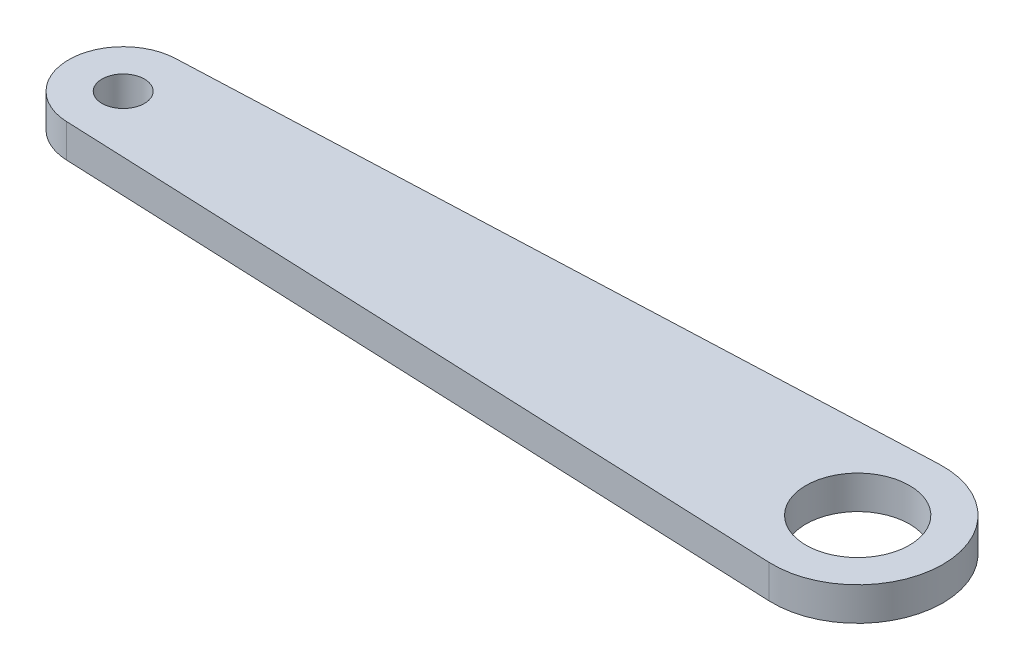
ISO-10303-21;
HEADER;
FILE_DESCRIPTION(('STEP AP214'),'2;1');
FILE_NAME('part.step','',(''),(''),'','','');
FILE_SCHEMA(('AUTOMOTIVE_DESIGN { 1 0 10303 214 1 1 1 1 }'));
ENDSEC;
DATA;
#1=APPLICATION_CONTEXT('core data for automotive mechanical design processes');
#2=APPLICATION_PROTOCOL_DEFINITION('international standard','automotive_design',2000,#1);
#3=PRODUCT_CONTEXT('',#1,'mechanical');
#4=PRODUCT('Part','Part','',(#3));
#5=PRODUCT_RELATED_PRODUCT_CATEGORY('part','',(#4));
#6=PRODUCT_DEFINITION_FORMATION('','',#4);
#7=PRODUCT_DEFINITION_CONTEXT('part definition',#1,'design');
#8=PRODUCT_DEFINITION('design','',#6,#7);
#9=PRODUCT_DEFINITION_SHAPE('','',#8);
#10=(LENGTH_UNIT() NAMED_UNIT(*) SI_UNIT(.MILLI.,.METRE.));
#11=(NAMED_UNIT(*) PLANE_ANGLE_UNIT() SI_UNIT($,.RADIAN.));
#12=(NAMED_UNIT(*) SI_UNIT($,.STERADIAN.) SOLID_ANGLE_UNIT());
#13=UNCERTAINTY_MEASURE_WITH_UNIT(LENGTH_MEASURE(1.E-05),#10,'distance_accuracy_value','');
#14=(GEOMETRIC_REPRESENTATION_CONTEXT(3) GLOBAL_UNCERTAINTY_ASSIGNED_CONTEXT((#13)) GLOBAL_UNIT_ASSIGNED_CONTEXT((#10,
#11,#12)) REPRESENTATION_CONTEXT('',''));
#15=CARTESIAN_POINT('',(0.,0.,0.));
#16=DIRECTION('',(0.,0.,1.));
#17=DIRECTION('',(1.,0.,0.));
#18=AXIS2_PLACEMENT_3D('',#15,#16,#17);
#19=CARTESIAN_POINT('',(-8.48725362794215,0.,16.6906997377325));
#20=DIRECTION('',(0.,1.,0.));
#21=DIRECTION('',(0.,0.,1.));
#22=AXIS2_PLACEMENT_3D('',#19,#20,#21);
#23=CYLINDRICAL_SURFACE('',#22,12.75);
#24=CARTESIAN_POINT('',(-8.48725362794215,5.,16.6906997377325));
#25=DIRECTION('',(0.,1.,0.));
#26=DIRECTION('',(0.,0.,1.));
#27=AXIS2_PLACEMENT_3D('',#24,#25,#26);
#28=CIRCLE('',#27,12.75);
#29=CARTESIAN_POINT('',(-9.01753771885124,5.,29.4296674660427));
#30=VERTEX_POINT('',#29);
#31=CARTESIAN_POINT('',(-9.01753771885124,5.,3.95173200942227));
#32=VERTEX_POINT('',#31);
#33=EDGE_CURVE('E98',#30,#32,#28,.T.);
#34=ORIENTED_EDGE('',*,*,#33,.F.);
#35=DIRECTION('',(0.,1.,0.));
#36=VECTOR('',#35,1.);
#37=CARTESIAN_POINT('',(-9.01753771885124,0.,29.4296674660427));
#38=LINE('',#37,#36);
#39=CARTESIAN_POINT('',(-9.01753771885124,0.,29.4296674660427));
#40=VERTEX_POINT('',#39);
#41=EDGE_CURVE('E11',#40,#30,#38,.T.);
#42=ORIENTED_EDGE('',*,*,#41,.F.);
#43=CARTESIAN_POINT('',(-8.48725362794215,0.,16.6906997377325));
#44=DIRECTION('',(0.,1.,0.));
#45=DIRECTION('',(0.,0.,1.));
#46=AXIS2_PLACEMENT_3D('',#43,#44,#45);
#47=CIRCLE('',#46,12.75);
#48=CARTESIAN_POINT('',(-9.01753771885124,0.,3.95173200942227));
#49=VERTEX_POINT('',#48);
#50=EDGE_CURVE('E91',#40,#49,#47,.T.);
#51=ORIENTED_EDGE('',*,*,#50,.T.);
#52=DIRECTION('',(0.,1.,0.));
#53=VECTOR('',#52,1.);
#54=CARTESIAN_POINT('',(-9.01753771885124,0.,3.95173200942227));
#55=LINE('',#54,#53);
#56=EDGE_CURVE('E36',#49,#32,#55,.T.);
#57=ORIENTED_EDGE('',*,*,#56,.T.);
#58=EDGE_LOOP('',(#34,#42,#51,#57));
#59=FACE_BOUND('',#58,.T.);
#60=ADVANCED_FACE('F33',(#59),#23,.T.);
#61=CARTESIAN_POINT('',(-118.82725930976,0.,24.8586261047078));
#62=DIRECTION('',(-0.0415909090909093,0.,0.999134723789035));
#63=DIRECTION('',(0.999134723789035,0.,0.0415909090909093));
#64=AXIS2_PLACEMENT_3D('',#61,#62,#63);
#65=PLANE('',#64);
#66=DIRECTION('',(0.999134723789035,0.,0.0415909090909093));
#67=VECTOR('',#66,1.);
#68=CARTESIAN_POINT('',(-118.82725930976,5.,24.8586261047078));
#69=LINE('',#68,#67);
#70=CARTESIAN_POINT('',(-118.82725930976,5.,24.8586261047078));
#71=VERTEX_POINT('',#70);
#72=EDGE_CURVE('E93',#71,#30,#69,.T.);
#73=ORIENTED_EDGE('',*,*,#72,.F.);
#74=DIRECTION('',(0.,1.,0.));
#75=VECTOR('',#74,1.);
#76=CARTESIAN_POINT('',(-118.82725930976,0.,24.8586261047078));
#77=LINE('',#76,#75);
#78=CARTESIAN_POINT('',(-118.82725930976,0.,24.8586261047078));
#79=VERTEX_POINT('',#78);
#80=EDGE_CURVE('E42',#79,#71,#77,.T.);
#81=ORIENTED_EDGE('',*,*,#80,.F.);
#82=DIRECTION('',(0.999134723789035,0.,0.0415909090909093));
#83=VECTOR('',#82,1.);
#84=CARTESIAN_POINT('',(-118.82725930976,0.,24.8586261047078));
#85=LINE('',#84,#83);
#86=EDGE_CURVE('E88',#79,#40,#85,.T.);
#87=ORIENTED_EDGE('',*,*,#86,.T.);
#88=ORIENTED_EDGE('',*,*,#41,.T.);
#89=EDGE_LOOP('',(#73,#81,#87,#88));
#90=FACE_BOUND('',#89,.T.);
#91=ADVANCED_FACE('F109',(#90),#65,.T.);
#92=CARTESIAN_POINT('',(-118.487253627942,0.,16.6906997377325));
#93=DIRECTION('',(0.,1.,0.));
#94=DIRECTION('',(0.,0.,1.));
#95=AXIS2_PLACEMENT_3D('',#92,#93,#94);
#96=CYLINDRICAL_SURFACE('',#95,8.175);
#97=CARTESIAN_POINT('',(-118.487253627942,5.,16.6906997377325));
#98=DIRECTION('',(0.,1.,0.));
#99=DIRECTION('',(0.,0.,1.));
#100=AXIS2_PLACEMENT_3D('',#97,#98,#99);
#101=CIRCLE('',#100,8.175);
#102=CARTESIAN_POINT('',(-118.82725930976,5.,8.52277337075708));
#103=VERTEX_POINT('',#102);
#104=EDGE_CURVE('E83',#103,#71,#101,.T.);
#105=ORIENTED_EDGE('',*,*,#104,.F.);
#106=DIRECTION('',(0.,1.,0.));
#107=VECTOR('',#106,1.);
#108=CARTESIAN_POINT('',(-118.82725930976,0.,8.52277337075708));
#109=LINE('',#108,#107);
#110=CARTESIAN_POINT('',(-118.82725930976,0.,8.52277337075708));
#111=VERTEX_POINT('',#110);
#112=EDGE_CURVE('E78',#111,#103,#109,.T.);
#113=ORIENTED_EDGE('',*,*,#112,.F.);
#114=CARTESIAN_POINT('',(-118.487253627942,0.,16.6906997377325));
#115=DIRECTION('',(0.,1.,0.));
#116=DIRECTION('',(0.,0.,1.));
#117=AXIS2_PLACEMENT_3D('',#114,#115,#116);
#118=CIRCLE('',#117,8.175);
#119=EDGE_CURVE('E81',#111,#79,#118,.T.);
#120=ORIENTED_EDGE('',*,*,#119,.T.);
#121=ORIENTED_EDGE('',*,*,#80,.T.);
#122=EDGE_LOOP('',(#105,#113,#120,#121));
#123=FACE_BOUND('',#122,.T.);
#124=ADVANCED_FACE('F80',(#123),#96,.T.);
#125=CARTESIAN_POINT('',(-9.01753771885124,0.,3.95173200942227));
#126=DIRECTION('',(-0.0415909090909092,0.,-0.999134723789035));
#127=DIRECTION('',(-0.999134723789035,0.,0.0415909090909092));
#128=AXIS2_PLACEMENT_3D('',#125,#126,#127);
#129=PLANE('',#128);
#130=DIRECTION('',(-0.999134723789035,0.,0.0415909090909092));
#131=VECTOR('',#130,1.);
#132=CARTESIAN_POINT('',(-9.01753771885124,5.,3.95173200942227));
#133=LINE('',#132,#131);
#134=EDGE_CURVE('E101',#32,#103,#133,.T.);
#135=ORIENTED_EDGE('',*,*,#134,.F.);
#136=ORIENTED_EDGE('',*,*,#56,.F.);
#137=DIRECTION('',(-0.999134723789035,0.,0.0415909090909092));
#138=VECTOR('',#137,1.);
#139=CARTESIAN_POINT('',(-9.01753771885124,0.,3.95173200942227));
#140=LINE('',#139,#138);
#141=EDGE_CURVE('E87',#49,#111,#140,.T.);
#142=ORIENTED_EDGE('',*,*,#141,.T.);
#143=ORIENTED_EDGE('',*,*,#112,.T.);
#144=EDGE_LOOP('',(#135,#136,#142,#143));
#145=FACE_BOUND('',#144,.T.);
#146=ADVANCED_FACE('F90',(#145),#129,.T.);
#147=CARTESIAN_POINT('',(-8.48725362794215,0.,16.6906997377325));
#148=DIRECTION('',(0.,1.,0.));
#149=DIRECTION('',(0.,0.,1.));
#150=AXIS2_PLACEMENT_3D('',#147,#148,#149);
#151=PLANE('',#150);
#152=CARTESIAN_POINT('',(-8.48725362794215,0.,16.6906997377325));
#153=DIRECTION('',(0.,1.,0.));
#154=DIRECTION('',(0.,0.,-1.));
#155=AXIS2_PLACEMENT_3D('',#152,#153,#154);
#156=CIRCLE('',#155,7.75);
#157=CARTESIAN_POINT('',(-8.48725362794215,0.,8.94069973773245));
#158=VERTEX_POINT('',#157);
#159=EDGE_CURVE('E142',#158,#158,#156,.T.);
#160=ORIENTED_EDGE('',*,*,#159,.T.);
#161=EDGE_LOOP('',(#160));
#162=FACE_BOUND('',#161,.T.);
#163=CARTESIAN_POINT('',(-118.487253627942,0.,16.6906997377325));
#164=DIRECTION('',(0.,1.,0.));
#165=DIRECTION('',(0.,0.,-1.));
#166=AXIS2_PLACEMENT_3D('',#163,#164,#165);
#167=CIRCLE('',#166,3.175);
#168=CARTESIAN_POINT('',(-118.487253627942,0.,13.5156997377325));
#169=VERTEX_POINT('',#168);
#170=EDGE_CURVE('E102',#169,#169,#167,.T.);
#171=ORIENTED_EDGE('',*,*,#170,.T.);
#172=EDGE_LOOP('',(#171));
#173=FACE_BOUND('',#172,.T.);
#174=ORIENTED_EDGE('',*,*,#50,.F.);
#175=ORIENTED_EDGE('',*,*,#86,.F.);
#176=ORIENTED_EDGE('',*,*,#119,.F.);
#177=ORIENTED_EDGE('',*,*,#141,.F.);
#178=EDGE_LOOP('',(#174,#175,#176,#177));
#179=FACE_BOUND('',#178,.T.);
#180=ADVANCED_FACE('F86',(#162,#173,#179),#151,.F.);
#181=CARTESIAN_POINT('',(-8.48725362794215,5.,16.6906997377325));
#182=DIRECTION('',(0.,1.,0.));
#183=DIRECTION('',(0.,0.,1.));
#184=AXIS2_PLACEMENT_3D('',#181,#182,#183);
#185=PLANE('',#184);
#186=CARTESIAN_POINT('',(-8.48725362794215,5.,16.6906997377325));
#187=DIRECTION('',(0.,1.,0.));
#188=DIRECTION('',(0.,0.,-1.));
#189=AXIS2_PLACEMENT_3D('',#186,#187,#188);
#190=CIRCLE('',#189,7.75);
#191=CARTESIAN_POINT('',(-8.48725362794215,5.,8.94069973773245));
#192=VERTEX_POINT('',#191);
#193=EDGE_CURVE('E145',#192,#192,#190,.T.);
#194=ORIENTED_EDGE('',*,*,#193,.F.);
#195=EDGE_LOOP('',(#194));
#196=FACE_BOUND('',#195,.T.);
#197=CARTESIAN_POINT('',(-118.487253627942,5.,16.6906997377325));
#198=DIRECTION('',(0.,1.,0.));
#199=DIRECTION('',(0.,0.,-1.));
#200=AXIS2_PLACEMENT_3D('',#197,#198,#199);
#201=CIRCLE('',#200,3.175);
#202=CARTESIAN_POINT('',(-118.487253627942,5.,13.5156997377325));
#203=VERTEX_POINT('',#202);
#204=EDGE_CURVE('E147',#203,#203,#201,.T.);
#205=ORIENTED_EDGE('',*,*,#204,.F.);
#206=EDGE_LOOP('',(#205));
#207=FACE_BOUND('',#206,.T.);
#208=ORIENTED_EDGE('',*,*,#33,.T.);
#209=ORIENTED_EDGE('',*,*,#134,.T.);
#210=ORIENTED_EDGE('',*,*,#104,.T.);
#211=ORIENTED_EDGE('',*,*,#72,.T.);
#212=EDGE_LOOP('',(#208,#209,#210,#211));
#213=FACE_BOUND('',#212,.T.);
#214=ADVANCED_FACE('F108',(#196,#207,#213),#185,.T.);
#215=CARTESIAN_POINT('',(-118.487253627942,0.,16.6906997377325));
#216=DIRECTION('',(0.,1.,0.));
#217=DIRECTION('',(0.,0.,1.));
#218=AXIS2_PLACEMENT_3D('',#215,#216,#217);
#219=CYLINDRICAL_SURFACE('',#218,3.175);
#220=ORIENTED_EDGE('',*,*,#170,.F.);
#221=EDGE_LOOP('',(#220));
#222=FACE_BOUND('',#221,.T.);
#223=ORIENTED_EDGE('',*,*,#204,.T.);
#224=EDGE_LOOP('',(#223));
#225=FACE_BOUND('',#224,.T.);
#226=ADVANCED_FACE('F127',(#222,#225),#219,.F.);
#227=CARTESIAN_POINT('',(-8.48725362794215,0.,16.6906997377325));
#228=DIRECTION('',(0.,1.,0.));
#229=DIRECTION('',(0.,0.,1.));
#230=AXIS2_PLACEMENT_3D('',#227,#228,#229);
#231=CYLINDRICAL_SURFACE('',#230,7.75);
#232=ORIENTED_EDGE('',*,*,#159,.F.);
#233=EDGE_LOOP('',(#232));
#234=FACE_BOUND('',#233,.T.);
#235=ORIENTED_EDGE('',*,*,#193,.T.);
#236=EDGE_LOOP('',(#235));
#237=FACE_BOUND('',#236,.T.);
#238=ADVANCED_FACE('F134',(#234,#237),#231,.F.);
#239=CLOSED_SHELL('',(#60,#91,#124,#146,#180,#214,#226,#238));
#240=MANIFOLD_SOLID_BREP('B2',#239);
#241=ADVANCED_BREP_SHAPE_REPRESENTATION('',(#18,#240),#14);
#242=SHAPE_DEFINITION_REPRESENTATION(#9,#241);
ENDSEC;
END-ISO-10303-21;
